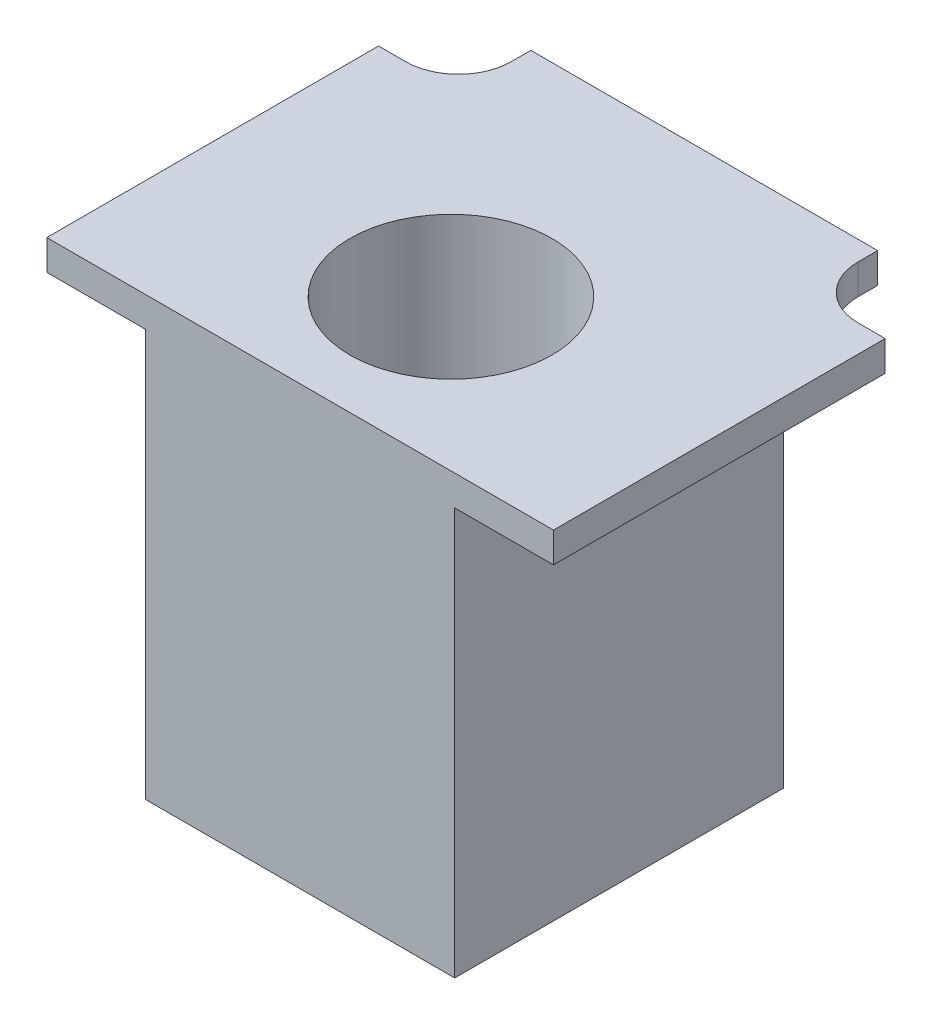
ISO-10303-21;
HEADER;
FILE_DESCRIPTION(('STEP AP214'),'2;1');
FILE_NAME('part.step','',(''),(''),'','','');
FILE_SCHEMA(('AUTOMOTIVE_DESIGN { 1 0 10303 214 1 1 1 1 }'));
ENDSEC;
DATA;
#1=APPLICATION_CONTEXT('core data for automotive mechanical design processes');
#2=APPLICATION_PROTOCOL_DEFINITION('international standard','automotive_design',2000,#1);
#3=PRODUCT_CONTEXT('',#1,'mechanical');
#4=PRODUCT('Part','Part','',(#3));
#5=PRODUCT_RELATED_PRODUCT_CATEGORY('part','',(#4));
#6=PRODUCT_DEFINITION_FORMATION('','',#4);
#7=PRODUCT_DEFINITION_CONTEXT('part definition',#1,'design');
#8=PRODUCT_DEFINITION('design','',#6,#7);
#9=PRODUCT_DEFINITION_SHAPE('','',#8);
#10=(LENGTH_UNIT() NAMED_UNIT(*) SI_UNIT(.MILLI.,.METRE.));
#11=(NAMED_UNIT(*) PLANE_ANGLE_UNIT() SI_UNIT($,.RADIAN.));
#12=(NAMED_UNIT(*) SI_UNIT($,.STERADIAN.) SOLID_ANGLE_UNIT());
#13=UNCERTAINTY_MEASURE_WITH_UNIT(LENGTH_MEASURE(1.E-05),#10,'distance_accuracy_value','');
#14=(GEOMETRIC_REPRESENTATION_CONTEXT(3) GLOBAL_UNCERTAINTY_ASSIGNED_CONTEXT((#13)) GLOBAL_UNIT_ASSIGNED_CONTEXT((#10,
#11,#12)) REPRESENTATION_CONTEXT('',''));
#15=CARTESIAN_POINT('',(0.,0.,0.));
#16=DIRECTION('',(0.,0.,1.));
#17=DIRECTION('',(1.,0.,0.));
#18=AXIS2_PLACEMENT_3D('',#15,#16,#17);
#19=CARTESIAN_POINT('',(5.125,1.5,-5.45));
#20=DIRECTION('',(-1.,0.,0.));
#21=DIRECTION('',(0.,0.,1.));
#22=AXIS2_PLACEMENT_3D('',#19,#20,#21);
#23=PLANE('',#22);
#24=DIRECTION('',(0.,0.,-1.));
#25=VECTOR('',#24,1.);
#26=CARTESIAN_POINT('',(5.125,13.5,0.));
#27=LINE('',#26,#25);
#28=CARTESIAN_POINT('',(5.125,13.5,5.45));
#29=VERTEX_POINT('',#28);
#30=CARTESIAN_POINT('',(5.125,13.5,-5.45));
#31=VERTEX_POINT('',#30);
#32=EDGE_CURVE('E227',#29,#31,#27,.T.);
#33=ORIENTED_EDGE('',*,*,#32,.F.);
#34=DIRECTION('',(0.,-1.,0.));
#35=VECTOR('',#34,1.);
#36=CARTESIAN_POINT('',(5.125,1.5,5.45));
#37=LINE('',#36,#35);
#38=CARTESIAN_POINT('',(5.125,0.,5.45));
#39=VERTEX_POINT('',#38);
#40=EDGE_CURVE('E382',#29,#39,#37,.T.);
#41=ORIENTED_EDGE('',*,*,#40,.T.);
#42=DIRECTION('',(0.,0.,-1.));
#43=VECTOR('',#42,1.);
#44=CARTESIAN_POINT('',(5.125,0.,-5.45));
#45=LINE('',#44,#43);
#46=CARTESIAN_POINT('',(5.125,0.,-5.45));
#47=VERTEX_POINT('',#46);
#48=EDGE_CURVE('E356',#39,#47,#45,.T.);
#49=ORIENTED_EDGE('',*,*,#48,.T.);
#50=DIRECTION('',(0.,-1.,0.));
#51=VECTOR('',#50,1.);
#52=CARTESIAN_POINT('',(5.125,1.5,-5.45));
#53=LINE('',#52,#51);
#54=EDGE_CURVE('E44',#31,#47,#53,.T.);
#55=ORIENTED_EDGE('',*,*,#54,.F.);
#56=EDGE_LOOP('',(#33,#41,#49,#55));
#57=FACE_BOUND('',#56,.T.);
#58=ADVANCED_FACE('F41',(#57),#23,.F.);
#59=CARTESIAN_POINT('',(-5.125,1.5,-5.45));
#60=DIRECTION('',(0.,0.,1.));
#61=DIRECTION('',(1.,0.,0.));
#62=AXIS2_PLACEMENT_3D('',#59,#60,#61);
#63=PLANE('',#62);
#64=DIRECTION('',(-1.,0.,0.));
#65=VECTOR('',#64,1.);
#66=CARTESIAN_POINT('',(0.,13.5,-5.45));
#67=LINE('',#66,#65);
#68=CARTESIAN_POINT('',(-5.125,13.5,-5.45));
#69=VERTEX_POINT('',#68);
#70=EDGE_CURVE('E224',#31,#69,#67,.T.);
#71=ORIENTED_EDGE('',*,*,#70,.F.);
#72=ORIENTED_EDGE('',*,*,#54,.T.);
#73=DIRECTION('',(-1.,0.,0.));
#74=VECTOR('',#73,1.);
#75=CARTESIAN_POINT('',(-5.125,0.,-5.45));
#76=LINE('',#75,#74);
#77=CARTESIAN_POINT('',(-5.125,0.,-5.45));
#78=VERTEX_POINT('',#77);
#79=EDGE_CURVE('E370',#47,#78,#76,.T.);
#80=ORIENTED_EDGE('',*,*,#79,.T.);
#81=DIRECTION('',(0.,-1.,0.));
#82=VECTOR('',#81,1.);
#83=CARTESIAN_POINT('',(-5.125,1.5,-5.45));
#84=LINE('',#83,#82);
#85=EDGE_CURVE('E387',#69,#78,#84,.T.);
#86=ORIENTED_EDGE('',*,*,#85,.F.);
#87=EDGE_LOOP('',(#71,#72,#80,#86));
#88=FACE_BOUND('',#87,.T.);
#89=ADVANCED_FACE('F397',(#88),#63,.F.);
#90=CARTESIAN_POINT('',(-5.125,1.5,-5.45));
#91=DIRECTION('',(1.,0.,0.));
#92=DIRECTION('',(0.,0.,-1.));
#93=AXIS2_PLACEMENT_3D('',#90,#91,#92);
#94=PLANE('',#93);
#95=DIRECTION('',(0.,0.,1.));
#96=VECTOR('',#95,1.);
#97=CARTESIAN_POINT('',(-5.125,13.5,0.));
#98=LINE('',#97,#96);
#99=CARTESIAN_POINT('',(-5.125,13.5,5.45));
#100=VERTEX_POINT('',#99);
#101=EDGE_CURVE('E220',#69,#100,#98,.T.);
#102=ORIENTED_EDGE('',*,*,#101,.F.);
#103=ORIENTED_EDGE('',*,*,#85,.T.);
#104=DIRECTION('',(0.,0.,1.));
#105=VECTOR('',#104,1.);
#106=CARTESIAN_POINT('',(-5.125,0.,-5.45));
#107=LINE('',#106,#105);
#108=CARTESIAN_POINT('',(-5.125,0.,5.45));
#109=VERTEX_POINT('',#108);
#110=EDGE_CURVE('E374',#78,#109,#107,.T.);
#111=ORIENTED_EDGE('',*,*,#110,.T.);
#112=DIRECTION('',(0.,-1.,0.));
#113=VECTOR('',#112,1.);
#114=CARTESIAN_POINT('',(-5.125,1.5,5.45));
#115=LINE('',#114,#113);
#116=EDGE_CURVE('E385',#100,#109,#115,.T.);
#117=ORIENTED_EDGE('',*,*,#116,.F.);
#118=EDGE_LOOP('',(#102,#103,#111,#117));
#119=FACE_BOUND('',#118,.T.);
#120=ADVANCED_FACE('F410',(#119),#94,.F.);
#121=CARTESIAN_POINT('',(0.,1.5,0.));
#122=DIRECTION('',(0.,1.,0.));
#123=DIRECTION('',(0.,0.,1.));
#124=AXIS2_PLACEMENT_3D('',#121,#122,#123);
#125=PLANE('',#124);
#126=DIRECTION('',(0.,0.,-1.));
#127=VECTOR('',#126,1.);
#128=CARTESIAN_POINT('',(3.195,1.5,-3.75));
#129=LINE('',#128,#127);
#130=CARTESIAN_POINT('',(3.195,1.5,1.45721149715439));
#131=VERTEX_POINT('',#130);
#132=CARTESIAN_POINT('',(3.195,1.5,-0.557211497154391));
#133=VERTEX_POINT('',#132);
#134=EDGE_CURVE('E348',#131,#133,#129,.T.);
#135=ORIENTED_EDGE('',*,*,#134,.F.);
#136=CARTESIAN_POINT('',(0.,1.5,0.45));
#137=DIRECTION('',(0.,1.,0.));
#138=DIRECTION('',(0.,0.,1.));
#139=AXIS2_PLACEMENT_3D('',#136,#137,#138);
#140=CIRCLE('',#139,3.35);
#141=EDGE_CURVE('E51',#131,#133,#140,.T.);
#142=ORIENTED_EDGE('',*,*,#141,.T.);
#143=EDGE_LOOP('',(#135,#142));
#144=FACE_BOUND('',#143,.T.);
#145=ADVANCED_FACE('F412',(#144),#125,.T.);
#146=DIRECTION('',(0.,0.,1.));
#147=VECTOR('',#146,1.);
#148=CARTESIAN_POINT('',(-3.195,1.5,-3.75));
#149=LINE('',#148,#147);
#150=CARTESIAN_POINT('',(-3.195,1.5,-0.557211497154394));
#151=VERTEX_POINT('',#150);
#152=CARTESIAN_POINT('',(-3.195,1.5,1.45721149715439));
#153=VERTEX_POINT('',#152);
#154=EDGE_CURVE('E339',#151,#153,#149,.T.);
#155=ORIENTED_EDGE('',*,*,#154,.F.);
#156=EDGE_CURVE('E11',#151,#153,#140,.T.);
#157=ORIENTED_EDGE('',*,*,#156,.T.);
#158=EDGE_LOOP('',(#155,#157));
#159=FACE_BOUND('',#158,.T.);
#160=ADVANCED_FACE('F418',(#159),#125,.T.);
#161=CARTESIAN_POINT('',(-5.125,1.5,5.45));
#162=DIRECTION('',(0.,0.,-1.));
#163=DIRECTION('',(-1.,0.,0.));
#164=AXIS2_PLACEMENT_3D('',#161,#162,#163);
#165=PLANE('',#164);
#166=DIRECTION('',(1.,0.,0.));
#167=VECTOR('',#166,1.);
#168=CARTESIAN_POINT('',(-5.125,0.,5.45));
#169=LINE('',#168,#167);
#170=EDGE_CURVE('E378',#109,#39,#169,.T.);
#171=ORIENTED_EDGE('',*,*,#170,.T.);
#172=ORIENTED_EDGE('',*,*,#40,.F.);
#173=DIRECTION('',(1.,0.,0.));
#174=VECTOR('',#173,1.);
#175=CARTESIAN_POINT('',(0.,13.5,5.45));
#176=LINE('',#175,#174);
#177=CARTESIAN_POINT('',(8.4,13.5,5.45));
#178=VERTEX_POINT('',#177);
#179=EDGE_CURVE('E221',#29,#178,#176,.T.);
#180=ORIENTED_EDGE('',*,*,#179,.T.);
#181=DIRECTION('',(0.,1.,0.));
#182=VECTOR('',#181,1.);
#183=CARTESIAN_POINT('',(8.4,13.5,5.45));
#184=LINE('',#183,#182);
#185=CARTESIAN_POINT('',(8.4,14.5,5.45));
#186=VERTEX_POINT('',#185);
#187=EDGE_CURVE('E298',#178,#186,#184,.T.);
#188=ORIENTED_EDGE('',*,*,#187,.T.);
#189=DIRECTION('',(1.,0.,0.));
#190=VECTOR('',#189,1.);
#191=CARTESIAN_POINT('',(-5.125,14.5,5.45));
#192=LINE('',#191,#190);
#193=CARTESIAN_POINT('',(-8.4,14.5,5.45));
#194=VERTEX_POINT('',#193);
#195=EDGE_CURVE('E311',#194,#186,#192,.T.);
#196=ORIENTED_EDGE('',*,*,#195,.F.);
#197=DIRECTION('',(0.,1.,0.));
#198=VECTOR('',#197,1.);
#199=CARTESIAN_POINT('',(-8.4,13.5,5.45));
#200=LINE('',#199,#198);
#201=CARTESIAN_POINT('',(-8.4,13.5,5.45));
#202=VERTEX_POINT('',#201);
#203=EDGE_CURVE('E302',#202,#194,#200,.T.);
#204=ORIENTED_EDGE('',*,*,#203,.F.);
#205=EDGE_CURVE('E214',#202,#100,#176,.T.);
#206=ORIENTED_EDGE('',*,*,#205,.T.);
#207=ORIENTED_EDGE('',*,*,#116,.T.);
#208=EDGE_LOOP('',(#171,#172,#180,#188,#196,#204,#206,#207));
#209=FACE_BOUND('',#208,.T.);
#210=ADVANCED_FACE('F408',(#209),#165,.F.);
#211=CARTESIAN_POINT('',(0.,0.,0.));
#212=DIRECTION('',(0.,1.,0.));
#213=DIRECTION('',(0.,0.,1.));
#214=AXIS2_PLACEMENT_3D('',#211,#212,#213);
#215=PLANE('',#214);
#216=DIRECTION('',(-1.,0.,0.));
#217=VECTOR('',#216,1.);
#218=CARTESIAN_POINT('',(-3.195,0.,-3.75));
#219=LINE('',#218,#217);
#220=CARTESIAN_POINT('',(3.195,0.,-3.75));
#221=VERTEX_POINT('',#220);
#222=CARTESIAN_POINT('',(-3.195,0.,-3.75));
#223=VERTEX_POINT('',#222);
#224=EDGE_CURVE('E329',#221,#223,#219,.T.);
#225=ORIENTED_EDGE('',*,*,#224,.T.);
#226=DIRECTION('',(0.,0.,1.));
#227=VECTOR('',#226,1.);
#228=CARTESIAN_POINT('',(-3.195,0.,-3.75));
#229=LINE('',#228,#227);
#230=CARTESIAN_POINT('',(-3.195,0.,4.65));
#231=VERTEX_POINT('',#230);
#232=EDGE_CURVE('E318',#223,#231,#229,.T.);
#233=ORIENTED_EDGE('',*,*,#232,.T.);
#234=DIRECTION('',(1.,0.,0.));
#235=VECTOR('',#234,1.);
#236=CARTESIAN_POINT('',(-3.195,0.,4.65));
#237=LINE('',#236,#235);
#238=CARTESIAN_POINT('',(3.195,0.,4.65));
#239=VERTEX_POINT('',#238);
#240=EDGE_CURVE('E322',#231,#239,#237,.T.);
#241=ORIENTED_EDGE('',*,*,#240,.T.);
#242=DIRECTION('',(0.,0.,-1.));
#243=VECTOR('',#242,1.);
#244=CARTESIAN_POINT('',(3.195,0.,-3.75));
#245=LINE('',#244,#243);
#246=EDGE_CURVE('E67',#239,#221,#245,.T.);
#247=ORIENTED_EDGE('',*,*,#246,.T.);
#248=EDGE_LOOP('',(#225,#233,#241,#247));
#249=FACE_BOUND('',#248,.T.);
#250=ORIENTED_EDGE('',*,*,#48,.F.);
#251=ORIENTED_EDGE('',*,*,#170,.F.);
#252=ORIENTED_EDGE('',*,*,#110,.F.);
#253=ORIENTED_EDGE('',*,*,#79,.F.);
#254=EDGE_LOOP('',(#250,#251,#252,#253));
#255=FACE_BOUND('',#254,.T.);
#256=ADVANCED_FACE('F403',(#249,#255),#215,.F.);
#257=CARTESIAN_POINT('',(-3.195,0.,-3.75));
#258=DIRECTION('',(-1.,0.,0.));
#259=DIRECTION('',(0.,0.,1.));
#260=AXIS2_PLACEMENT_3D('',#257,#258,#259);
#261=PLANE('',#260);
#262=CARTESIAN_POINT('',(-3.195,1.5,-3.75));
#263=VERTEX_POINT('',#262);
#264=EDGE_CURVE('E334',#263,#151,#149,.T.);
#265=ORIENTED_EDGE('',*,*,#264,.T.);
#266=ORIENTED_EDGE('',*,*,#154,.T.);
#267=CARTESIAN_POINT('',(-3.195,1.5,4.65));
#268=VERTEX_POINT('',#267);
#269=EDGE_CURVE('E317',#153,#268,#149,.T.);
#270=ORIENTED_EDGE('',*,*,#269,.T.);
#271=DIRECTION('',(0.,1.,0.));
#272=VECTOR('',#271,1.);
#273=CARTESIAN_POINT('',(-3.195,0.,4.65));
#274=LINE('',#273,#272);
#275=EDGE_CURVE('E333',#231,#268,#274,.T.);
#276=ORIENTED_EDGE('',*,*,#275,.F.);
#277=ORIENTED_EDGE('',*,*,#232,.F.);
#278=DIRECTION('',(0.,1.,0.));
#279=VECTOR('',#278,1.);
#280=CARTESIAN_POINT('',(-3.195,0.,-3.75));
#281=LINE('',#280,#279);
#282=EDGE_CURVE('E352',#223,#263,#281,.T.);
#283=ORIENTED_EDGE('',*,*,#282,.T.);
#284=EDGE_LOOP('',(#265,#266,#270,#276,#277,#283));
#285=FACE_BOUND('',#284,.T.);
#286=ADVANCED_FACE('F571',(#285),#261,.F.);
#287=CARTESIAN_POINT('',(-3.195,0.,-3.75));
#288=DIRECTION('',(0.,0.,-1.));
#289=DIRECTION('',(-1.,0.,0.));
#290=AXIS2_PLACEMENT_3D('',#287,#288,#289);
#291=PLANE('',#290);
#292=DIRECTION('',(-1.,0.,0.));
#293=VECTOR('',#292,1.);
#294=CARTESIAN_POINT('',(-3.195,1.5,-3.75));
#295=LINE('',#294,#293);
#296=CARTESIAN_POINT('',(3.195,1.5,-3.75));
#297=VERTEX_POINT('',#296);
#298=EDGE_CURVE('E323',#297,#263,#295,.T.);
#299=ORIENTED_EDGE('',*,*,#298,.T.);
#300=ORIENTED_EDGE('',*,*,#282,.F.);
#301=ORIENTED_EDGE('',*,*,#224,.F.);
#302=DIRECTION('',(0.,1.,0.));
#303=VECTOR('',#302,1.);
#304=CARTESIAN_POINT('',(3.195,0.,-3.75));
#305=LINE('',#304,#303);
#306=EDGE_CURVE('E357',#221,#297,#305,.T.);
#307=ORIENTED_EDGE('',*,*,#306,.T.);
#308=EDGE_LOOP('',(#299,#300,#301,#307));
#309=FACE_BOUND('',#308,.T.);
#310=ADVANCED_FACE('F567',(#309),#291,.F.);
#311=CARTESIAN_POINT('',(3.195,0.,-3.75));
#312=DIRECTION('',(1.,0.,0.));
#313=DIRECTION('',(0.,0.,-1.));
#314=AXIS2_PLACEMENT_3D('',#311,#312,#313);
#315=PLANE('',#314);
#316=CARTESIAN_POINT('',(3.195,1.5,4.65));
#317=VERTEX_POINT('',#316);
#318=EDGE_CURVE('E344',#317,#131,#129,.T.);
#319=ORIENTED_EDGE('',*,*,#318,.T.);
#320=ORIENTED_EDGE('',*,*,#134,.T.);
#321=EDGE_CURVE('E343',#133,#297,#129,.T.);
#322=ORIENTED_EDGE('',*,*,#321,.T.);
#323=ORIENTED_EDGE('',*,*,#306,.F.);
#324=ORIENTED_EDGE('',*,*,#246,.F.);
#325=DIRECTION('',(0.,1.,0.));
#326=VECTOR('',#325,1.);
#327=CARTESIAN_POINT('',(3.195,0.,4.65));
#328=LINE('',#327,#326);
#329=EDGE_CURVE('E361',#239,#317,#328,.T.);
#330=ORIENTED_EDGE('',*,*,#329,.T.);
#331=EDGE_LOOP('',(#319,#320,#322,#323,#324,#330));
#332=FACE_BOUND('',#331,.T.);
#333=ADVANCED_FACE('F570',(#332),#315,.F.);
#334=CARTESIAN_POINT('',(-3.195,0.,4.65));
#335=DIRECTION('',(0.,0.,1.));
#336=DIRECTION('',(1.,0.,0.));
#337=AXIS2_PLACEMENT_3D('',#334,#335,#336);
#338=PLANE('',#337);
#339=DIRECTION('',(1.,0.,0.));
#340=VECTOR('',#339,1.);
#341=CARTESIAN_POINT('',(-3.195,1.5,4.65));
#342=LINE('',#341,#340);
#343=EDGE_CURVE('E338',#268,#317,#342,.T.);
#344=ORIENTED_EDGE('',*,*,#343,.T.);
#345=ORIENTED_EDGE('',*,*,#329,.F.);
#346=ORIENTED_EDGE('',*,*,#240,.F.);
#347=ORIENTED_EDGE('',*,*,#275,.T.);
#348=EDGE_LOOP('',(#344,#345,#346,#347));
#349=FACE_BOUND('',#348,.T.);
#350=ADVANCED_FACE('F575',(#349),#338,.F.);
#351=CARTESIAN_POINT('',(0.,1.5,0.));
#352=DIRECTION('',(0.,1.,0.));
#353=DIRECTION('',(0.,0.,1.));
#354=AXIS2_PLACEMENT_3D('',#351,#352,#353);
#355=PLANE('',#354);
#356=ORIENTED_EDGE('',*,*,#264,.F.);
#357=ORIENTED_EDGE('',*,*,#298,.F.);
#358=ORIENTED_EDGE('',*,*,#321,.F.);
#359=EDGE_CURVE('E52',#133,#151,#140,.T.);
#360=ORIENTED_EDGE('',*,*,#359,.T.);
#361=EDGE_LOOP('',(#356,#357,#358,#360));
#362=FACE_BOUND('',#361,.T.);
#363=ADVANCED_FACE('F458',(#362),#355,.F.);
#364=CARTESIAN_POINT('',(0.,14.5,0.));
#365=DIRECTION('',(0.,1.,0.));
#366=DIRECTION('',(0.,0.,1.));
#367=AXIS2_PLACEMENT_3D('',#364,#365,#366);
#368=PLANE('',#367);
#369=ORIENTED_EDGE('',*,*,#195,.T.);
#370=DIRECTION('',(0.,0.,-1.));
#371=VECTOR('',#370,1.);
#372=CARTESIAN_POINT('',(8.4,14.5,0.));
#373=LINE('',#372,#371);
#374=CARTESIAN_POINT('',(8.4,14.5,-5.55));
#375=VERTEX_POINT('',#374);
#376=EDGE_CURVE('E258',#186,#375,#373,.T.);
#377=ORIENTED_EDGE('',*,*,#376,.T.);
#378=DIRECTION('',(1.,0.,0.));
#379=VECTOR('',#378,1.);
#380=CARTESIAN_POINT('',(0.,14.5,-5.55));
#381=LINE('',#380,#379);
#382=CARTESIAN_POINT('',(7.5,14.5,-5.55));
#383=VERTEX_POINT('',#382);
#384=EDGE_CURVE('E262',#383,#375,#381,.T.);
#385=ORIENTED_EDGE('',*,*,#384,.F.);
#386=CARTESIAN_POINT('',(7.5,14.5,-7.3));
#387=DIRECTION('',(0.,1.,0.));
#388=DIRECTION('',(0.,0.,1.));
#389=AXIS2_PLACEMENT_3D('',#386,#387,#388);
#390=CIRCLE('',#389,1.75);
#391=CARTESIAN_POINT('',(5.75,14.5,-7.3));
#392=VERTEX_POINT('',#391);
#393=EDGE_CURVE('E266',#392,#383,#390,.T.);
#394=ORIENTED_EDGE('',*,*,#393,.F.);
#395=DIRECTION('',(0.,0.,-1.));
#396=VECTOR('',#395,1.);
#397=CARTESIAN_POINT('',(5.75,14.5,0.));
#398=LINE('',#397,#396);
#399=CARTESIAN_POINT('',(5.75,14.5,-7.95));
#400=VERTEX_POINT('',#399);
#401=EDGE_CURVE('E269',#392,#400,#398,.T.);
#402=ORIENTED_EDGE('',*,*,#401,.T.);
#403=DIRECTION('',(1.,0.,0.));
#404=VECTOR('',#403,1.);
#405=CARTESIAN_POINT('',(0.,14.5,-7.95));
#406=LINE('',#405,#404);
#407=CARTESIAN_POINT('',(-5.75,14.5,-7.95));
#408=VERTEX_POINT('',#407);
#409=EDGE_CURVE('E273',#408,#400,#406,.T.);
#410=ORIENTED_EDGE('',*,*,#409,.F.);
#411=DIRECTION('',(0.,0.,-1.));
#412=VECTOR('',#411,1.);
#413=CARTESIAN_POINT('',(-5.75,14.5,0.));
#414=LINE('',#413,#412);
#415=CARTESIAN_POINT('',(-5.75,14.5,-7.3));
#416=VERTEX_POINT('',#415);
#417=EDGE_CURVE('E204',#416,#408,#414,.T.);
#418=ORIENTED_EDGE('',*,*,#417,.F.);
#419=CARTESIAN_POINT('',(-7.5,14.5,-7.3));
#420=DIRECTION('',(0.,1.,0.));
#421=DIRECTION('',(0.,0.,1.));
#422=AXIS2_PLACEMENT_3D('',#419,#420,#421);
#423=CIRCLE('',#422,1.75);
#424=CARTESIAN_POINT('',(-7.5,14.5,-5.55));
#425=VERTEX_POINT('',#424);
#426=EDGE_CURVE('E249',#425,#416,#423,.T.);
#427=ORIENTED_EDGE('',*,*,#426,.F.);
#428=DIRECTION('',(-1.,0.,0.));
#429=VECTOR('',#428,1.);
#430=CARTESIAN_POINT('',(0.,14.5,-5.55));
#431=LINE('',#430,#429);
#432=CARTESIAN_POINT('',(-8.4,14.5,-5.55));
#433=VERTEX_POINT('',#432);
#434=EDGE_CURVE('E188',#425,#433,#431,.T.);
#435=ORIENTED_EDGE('',*,*,#434,.T.);
#436=DIRECTION('',(0.,0.,1.));
#437=VECTOR('',#436,1.);
#438=CARTESIAN_POINT('',(-8.4,14.5,0.));
#439=LINE('',#438,#437);
#440=EDGE_CURVE('E254',#433,#194,#439,.T.);
#441=ORIENTED_EDGE('',*,*,#440,.T.);
#442=EDGE_LOOP('',(#369,#377,#385,#394,#402,#410,#418,#427,#435,#441));
#443=FACE_BOUND('',#442,.T.);
#444=CARTESIAN_POINT('',(0.,14.5,0.45));
#445=DIRECTION('',(0.,1.,0.));
#446=DIRECTION('',(0.,0.,1.));
#447=AXIS2_PLACEMENT_3D('',#444,#445,#446);
#448=CIRCLE('',#447,3.35);
#449=CARTESIAN_POINT('',(0.,14.5,3.8));
#450=VERTEX_POINT('',#449);
#451=EDGE_CURVE('E308',#450,#450,#448,.T.);
#452=ORIENTED_EDGE('',*,*,#451,.F.);
#453=EDGE_LOOP('',(#452));
#454=FACE_BOUND('',#453,.T.);
#455=ADVANCED_FACE('F453',(#443,#454),#368,.T.);
#456=ORIENTED_EDGE('',*,*,#269,.F.);
#457=EDGE_CURVE('E59',#153,#131,#140,.T.);
#458=ORIENTED_EDGE('',*,*,#457,.T.);
#459=ORIENTED_EDGE('',*,*,#318,.F.);
#460=ORIENTED_EDGE('',*,*,#343,.F.);
#461=EDGE_LOOP('',(#456,#458,#459,#460));
#462=FACE_BOUND('',#461,.T.);
#463=ADVANCED_FACE('F457',(#462),#355,.F.);
#464=CARTESIAN_POINT('',(0.,14.5,0.45));
#465=DIRECTION('',(0.,-1.,0.));
#466=DIRECTION('',(0.,0.,-1.));
#467=AXIS2_PLACEMENT_3D('',#464,#465,#466);
#468=CYLINDRICAL_SURFACE('',#467,3.35);
#469=ORIENTED_EDGE('',*,*,#451,.T.);
#470=EDGE_LOOP('',(#469));
#471=FACE_BOUND('',#470,.T.);
#472=ORIENTED_EDGE('',*,*,#141,.F.);
#473=ORIENTED_EDGE('',*,*,#457,.F.);
#474=ORIENTED_EDGE('',*,*,#156,.F.);
#475=ORIENTED_EDGE('',*,*,#359,.F.);
#476=EDGE_LOOP('',(#472,#473,#474,#475));
#477=FACE_BOUND('',#476,.T.);
#478=ADVANCED_FACE('F472',(#471,#477),#468,.F.);
#479=CARTESIAN_POINT('',(-7.5,13.5,-7.3));
#480=DIRECTION('',(0.,1.,0.));
#481=DIRECTION('',(0.,0.,1.));
#482=AXIS2_PLACEMENT_3D('',#479,#480,#481);
#483=CYLINDRICAL_SURFACE('',#482,1.75);
#484=ORIENTED_EDGE('',*,*,#426,.T.);
#485=DIRECTION('',(0.,1.,0.));
#486=VECTOR('',#485,1.);
#487=CARTESIAN_POINT('',(-5.75,13.5,-7.3));
#488=LINE('',#487,#486);
#489=CARTESIAN_POINT('',(-5.75,13.5,-7.3));
#490=VERTEX_POINT('',#489);
#491=EDGE_CURVE('E201',#490,#416,#488,.T.);
#492=ORIENTED_EDGE('',*,*,#491,.F.);
#493=CARTESIAN_POINT('',(-7.5,13.5,-7.3));
#494=DIRECTION('',(0.,1.,0.));
#495=DIRECTION('',(0.,0.,1.));
#496=AXIS2_PLACEMENT_3D('',#493,#494,#495);
#497=CIRCLE('',#496,1.75);
#498=CARTESIAN_POINT('',(-7.5,13.5,-5.55));
#499=VERTEX_POINT('',#498);
#500=EDGE_CURVE('E198',#499,#490,#497,.T.);
#501=ORIENTED_EDGE('',*,*,#500,.F.);
#502=DIRECTION('',(0.,1.,0.));
#503=VECTOR('',#502,1.);
#504=CARTESIAN_POINT('',(-7.5,13.5,-5.55));
#505=LINE('',#504,#503);
#506=EDGE_CURVE('E182',#499,#425,#505,.T.);
#507=ORIENTED_EDGE('',*,*,#506,.T.);
#508=EDGE_LOOP('',(#484,#492,#501,#507));
#509=FACE_BOUND('',#508,.T.);
#510=ADVANCED_FACE('F199',(#509),#483,.F.);
#511=CARTESIAN_POINT('',(-5.75,13.5,0.));
#512=DIRECTION('',(1.,0.,0.));
#513=DIRECTION('',(0.,0.,-1.));
#514=AXIS2_PLACEMENT_3D('',#511,#512,#513);
#515=PLANE('',#514);
#516=ORIENTED_EDGE('',*,*,#417,.T.);
#517=DIRECTION('',(0.,1.,0.));
#518=VECTOR('',#517,1.);
#519=CARTESIAN_POINT('',(-5.75,13.5,-7.95));
#520=LINE('',#519,#518);
#521=CARTESIAN_POINT('',(-5.75,13.5,-7.95));
#522=VERTEX_POINT('',#521);
#523=EDGE_CURVE('E281',#522,#408,#520,.T.);
#524=ORIENTED_EDGE('',*,*,#523,.F.);
#525=DIRECTION('',(0.,0.,-1.));
#526=VECTOR('',#525,1.);
#527=CARTESIAN_POINT('',(-5.75,13.5,0.));
#528=LINE('',#527,#526);
#529=EDGE_CURVE('E194',#490,#522,#528,.T.);
#530=ORIENTED_EDGE('',*,*,#529,.F.);
#531=ORIENTED_EDGE('',*,*,#491,.T.);
#532=EDGE_LOOP('',(#516,#524,#530,#531));
#533=FACE_BOUND('',#532,.T.);
#534=ADVANCED_FACE('F471',(#533),#515,.F.);
#535=CARTESIAN_POINT('',(0.,13.5,-7.95));
#536=DIRECTION('',(0.,0.,1.));
#537=DIRECTION('',(1.,0.,0.));
#538=AXIS2_PLACEMENT_3D('',#535,#536,#537);
#539=PLANE('',#538);
#540=ORIENTED_EDGE('',*,*,#409,.T.);
#541=DIRECTION('',(0.,1.,0.));
#542=VECTOR('',#541,1.);
#543=CARTESIAN_POINT('',(5.75,13.5,-7.95));
#544=LINE('',#543,#542);
#545=CARTESIAN_POINT('',(5.75,13.5,-7.95));
#546=VERTEX_POINT('',#545);
#547=EDGE_CURVE('E285',#546,#400,#544,.T.);
#548=ORIENTED_EDGE('',*,*,#547,.F.);
#549=DIRECTION('',(1.,0.,0.));
#550=VECTOR('',#549,1.);
#551=CARTESIAN_POINT('',(0.,13.5,-7.95));
#552=LINE('',#551,#550);
#553=EDGE_CURVE('E244',#522,#546,#552,.T.);
#554=ORIENTED_EDGE('',*,*,#553,.F.);
#555=ORIENTED_EDGE('',*,*,#523,.T.);
#556=EDGE_LOOP('',(#540,#548,#554,#555));
#557=FACE_BOUND('',#556,.T.);
#558=ADVANCED_FACE('F482',(#557),#539,.F.);
#559=CARTESIAN_POINT('',(5.75,13.5,0.));
#560=DIRECTION('',(1.,0.,0.));
#561=DIRECTION('',(0.,0.,-1.));
#562=AXIS2_PLACEMENT_3D('',#559,#560,#561);
#563=PLANE('',#562);
#564=ORIENTED_EDGE('',*,*,#401,.F.);
#565=DIRECTION('',(0.,1.,0.));
#566=VECTOR('',#565,1.);
#567=CARTESIAN_POINT('',(5.75,13.5,-7.3));
#568=LINE('',#567,#566);
#569=CARTESIAN_POINT('',(5.75,13.5,-7.3));
#570=VERTEX_POINT('',#569);
#571=EDGE_CURVE('E288',#570,#392,#568,.T.);
#572=ORIENTED_EDGE('',*,*,#571,.F.);
#573=DIRECTION('',(0.,0.,-1.));
#574=VECTOR('',#573,1.);
#575=CARTESIAN_POINT('',(5.75,13.5,0.));
#576=LINE('',#575,#574);
#577=EDGE_CURVE('E240',#570,#546,#576,.T.);
#578=ORIENTED_EDGE('',*,*,#577,.T.);
#579=ORIENTED_EDGE('',*,*,#547,.T.);
#580=EDGE_LOOP('',(#564,#572,#578,#579));
#581=FACE_BOUND('',#580,.T.);
#582=ADVANCED_FACE('F492',(#581),#563,.T.);
#583=CARTESIAN_POINT('',(7.5,13.5,-7.3));
#584=DIRECTION('',(0.,1.,0.));
#585=DIRECTION('',(0.,0.,1.));
#586=AXIS2_PLACEMENT_3D('',#583,#584,#585);
#587=CYLINDRICAL_SURFACE('',#586,1.75);
#588=ORIENTED_EDGE('',*,*,#393,.T.);
#589=DIRECTION('',(0.,1.,0.));
#590=VECTOR('',#589,1.);
#591=CARTESIAN_POINT('',(7.5,13.5,-5.55));
#592=LINE('',#591,#590);
#593=CARTESIAN_POINT('',(7.5,13.5,-5.55));
#594=VERTEX_POINT('',#593);
#595=EDGE_CURVE('E291',#594,#383,#592,.T.);
#596=ORIENTED_EDGE('',*,*,#595,.F.);
#597=CARTESIAN_POINT('',(7.5,13.5,-7.3));
#598=DIRECTION('',(0.,1.,0.));
#599=DIRECTION('',(0.,0.,1.));
#600=AXIS2_PLACEMENT_3D('',#597,#598,#599);
#601=CIRCLE('',#600,1.75);
#602=EDGE_CURVE('E237',#570,#594,#601,.T.);
#603=ORIENTED_EDGE('',*,*,#602,.F.);
#604=ORIENTED_EDGE('',*,*,#571,.T.);
#605=EDGE_LOOP('',(#588,#596,#603,#604));
#606=FACE_BOUND('',#605,.T.);
#607=ADVANCED_FACE('F502',(#606),#587,.F.);
#608=CARTESIAN_POINT('',(0.,13.5,-5.55));
#609=DIRECTION('',(0.,0.,1.));
#610=DIRECTION('',(1.,0.,0.));
#611=AXIS2_PLACEMENT_3D('',#608,#609,#610);
#612=PLANE('',#611);
#613=ORIENTED_EDGE('',*,*,#384,.T.);
#614=DIRECTION('',(0.,1.,0.));
#615=VECTOR('',#614,1.);
#616=CARTESIAN_POINT('',(8.4,13.5,-5.55));
#617=LINE('',#616,#615);
#618=CARTESIAN_POINT('',(8.4,13.5,-5.55));
#619=VERTEX_POINT('',#618);
#620=EDGE_CURVE('E295',#619,#375,#617,.T.);
#621=ORIENTED_EDGE('',*,*,#620,.F.);
#622=DIRECTION('',(1.,0.,0.));
#623=VECTOR('',#622,1.);
#624=CARTESIAN_POINT('',(0.,13.5,-5.55));
#625=LINE('',#624,#623);
#626=EDGE_CURVE('E234',#594,#619,#625,.T.);
#627=ORIENTED_EDGE('',*,*,#626,.F.);
#628=ORIENTED_EDGE('',*,*,#595,.T.);
#629=EDGE_LOOP('',(#613,#621,#627,#628));
#630=FACE_BOUND('',#629,.T.);
#631=ADVANCED_FACE('F512',(#630),#612,.F.);
#632=CARTESIAN_POINT('',(8.4,13.5,0.));
#633=DIRECTION('',(1.,0.,0.));
#634=DIRECTION('',(0.,0.,-1.));
#635=AXIS2_PLACEMENT_3D('',#632,#633,#634);
#636=PLANE('',#635);
#637=ORIENTED_EDGE('',*,*,#376,.F.);
#638=ORIENTED_EDGE('',*,*,#187,.F.);
#639=DIRECTION('',(0.,0.,-1.));
#640=VECTOR('',#639,1.);
#641=CARTESIAN_POINT('',(8.4,13.5,0.));
#642=LINE('',#641,#640);
#643=EDGE_CURVE('E230',#178,#619,#642,.T.);
#644=ORIENTED_EDGE('',*,*,#643,.T.);
#645=ORIENTED_EDGE('',*,*,#620,.T.);
#646=EDGE_LOOP('',(#637,#638,#644,#645));
#647=FACE_BOUND('',#646,.T.);
#648=ADVANCED_FACE('F522',(#647),#636,.T.);
#649=CARTESIAN_POINT('',(-8.4,13.5,0.));
#650=DIRECTION('',(-1.,0.,0.));
#651=DIRECTION('',(0.,0.,1.));
#652=AXIS2_PLACEMENT_3D('',#649,#650,#651);
#653=PLANE('',#652);
#654=ORIENTED_EDGE('',*,*,#440,.F.);
#655=DIRECTION('',(0.,1.,0.));
#656=VECTOR('',#655,1.);
#657=CARTESIAN_POINT('',(-8.4,13.5,-5.55));
#658=LINE('',#657,#656);
#659=CARTESIAN_POINT('',(-8.4,13.5,-5.55));
#660=VERTEX_POINT('',#659);
#661=EDGE_CURVE('E193',#660,#433,#658,.T.);
#662=ORIENTED_EDGE('',*,*,#661,.F.);
#663=DIRECTION('',(0.,0.,1.));
#664=VECTOR('',#663,1.);
#665=CARTESIAN_POINT('',(-8.4,13.5,0.));
#666=LINE('',#665,#664);
#667=EDGE_CURVE('E210',#660,#202,#666,.T.);
#668=ORIENTED_EDGE('',*,*,#667,.T.);
#669=ORIENTED_EDGE('',*,*,#203,.T.);
#670=EDGE_LOOP('',(#654,#662,#668,#669));
#671=FACE_BOUND('',#670,.T.);
#672=ADVANCED_FACE('F532',(#671),#653,.T.);
#673=CARTESIAN_POINT('',(0.,13.5,-5.55));
#674=DIRECTION('',(0.,0.,-1.));
#675=DIRECTION('',(-1.,0.,0.));
#676=AXIS2_PLACEMENT_3D('',#673,#674,#675);
#677=PLANE('',#676);
#678=ORIENTED_EDGE('',*,*,#434,.F.);
#679=ORIENTED_EDGE('',*,*,#506,.F.);
#680=DIRECTION('',(-1.,0.,0.));
#681=VECTOR('',#680,1.);
#682=CARTESIAN_POINT('',(0.,13.5,-5.55));
#683=LINE('',#682,#681);
#684=EDGE_CURVE('E186',#499,#660,#683,.T.);
#685=ORIENTED_EDGE('',*,*,#684,.T.);
#686=ORIENTED_EDGE('',*,*,#661,.T.);
#687=EDGE_LOOP('',(#678,#679,#685,#686));
#688=FACE_BOUND('',#687,.T.);
#689=ADVANCED_FACE('F184',(#688),#677,.T.);
#690=CARTESIAN_POINT('',(0.,13.5,0.));
#691=DIRECTION('',(0.,1.,0.));
#692=DIRECTION('',(0.,0.,1.));
#693=AXIS2_PLACEMENT_3D('',#690,#691,#692);
#694=PLANE('',#693);
#695=ORIENTED_EDGE('',*,*,#500,.T.);
#696=ORIENTED_EDGE('',*,*,#529,.T.);
#697=ORIENTED_EDGE('',*,*,#553,.T.);
#698=ORIENTED_EDGE('',*,*,#577,.F.);
#699=ORIENTED_EDGE('',*,*,#602,.T.);
#700=ORIENTED_EDGE('',*,*,#626,.T.);
#701=ORIENTED_EDGE('',*,*,#643,.F.);
#702=ORIENTED_EDGE('',*,*,#179,.F.);
#703=ORIENTED_EDGE('',*,*,#32,.T.);
#704=ORIENTED_EDGE('',*,*,#70,.T.);
#705=ORIENTED_EDGE('',*,*,#101,.T.);
#706=ORIENTED_EDGE('',*,*,#205,.F.);
#707=ORIENTED_EDGE('',*,*,#667,.F.);
#708=ORIENTED_EDGE('',*,*,#684,.F.);
#709=EDGE_LOOP('',(#695,#696,#697,#698,#699,#700,#701,#702,#703,#704,#705,#706,#707,#708));
#710=FACE_BOUND('',#709,.T.);
#711=ADVANCED_FACE('F207',(#710),#694,.F.);
#712=CLOSED_SHELL('',(#58,#89,#120,#145,#160,#210,#256,#286,#310,#333,#350,#363,#455,#463,#478,
#510,#534,#558,#582,#607,#631,#648,#672,#689,#711));
#713=MANIFOLD_SOLID_BREP('B2',#712);
#714=ADVANCED_BREP_SHAPE_REPRESENTATION('',(#18,#713),#14);
#715=SHAPE_DEFINITION_REPRESENTATION(#9,#714);
ENDSEC;
END-ISO-10303-21;
